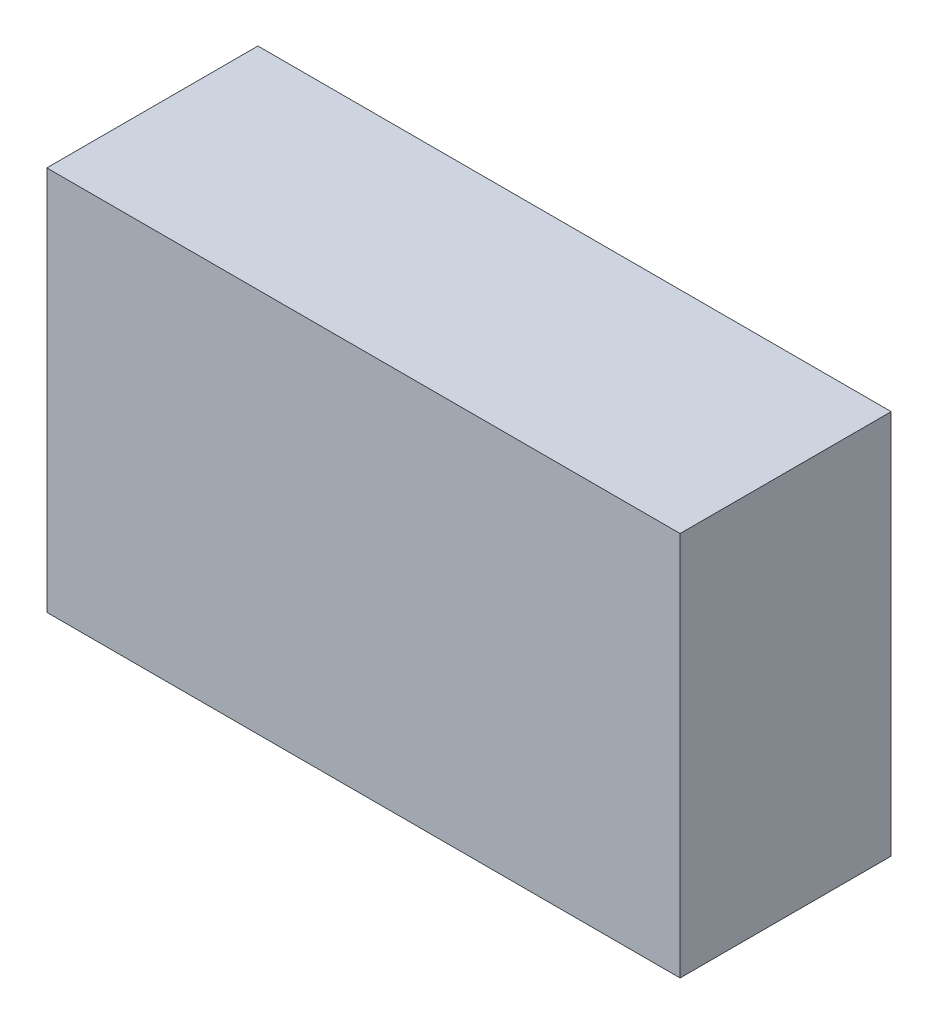
ISO-10303-21;
HEADER;
FILE_DESCRIPTION(('STEP AP214'),'2;1');
FILE_NAME('part.step','',(''),(''),'','','');
FILE_SCHEMA(('AUTOMOTIVE_DESIGN { 1 0 10303 214 1 1 1 1 }'));
ENDSEC;
DATA;
#1=APPLICATION_CONTEXT('core data for automotive mechanical design processes');
#2=APPLICATION_PROTOCOL_DEFINITION('international standard','automotive_design',2000,#1);
#3=PRODUCT_CONTEXT('',#1,'mechanical');
#4=PRODUCT('Part','Part','',(#3));
#5=PRODUCT_RELATED_PRODUCT_CATEGORY('part','',(#4));
#6=PRODUCT_DEFINITION_FORMATION('','',#4);
#7=PRODUCT_DEFINITION_CONTEXT('part definition',#1,'design');
#8=PRODUCT_DEFINITION('design','',#6,#7);
#9=PRODUCT_DEFINITION_SHAPE('','',#8);
#10=(LENGTH_UNIT() NAMED_UNIT(*) SI_UNIT(.MILLI.,.METRE.));
#11=(NAMED_UNIT(*) PLANE_ANGLE_UNIT() SI_UNIT($,.RADIAN.));
#12=(NAMED_UNIT(*) SI_UNIT($,.STERADIAN.) SOLID_ANGLE_UNIT());
#13=UNCERTAINTY_MEASURE_WITH_UNIT(LENGTH_MEASURE(1.E-05),#10,'distance_accuracy_value','');
#14=(GEOMETRIC_REPRESENTATION_CONTEXT(3) GLOBAL_UNCERTAINTY_ASSIGNED_CONTEXT((#13)) GLOBAL_UNIT_ASSIGNED_CONTEXT((#10,
#11,#12)) REPRESENTATION_CONTEXT('',''));
#15=CARTESIAN_POINT('',(0.,0.,0.));
#16=DIRECTION('',(0.,0.,1.));
#17=DIRECTION('',(1.,0.,0.));
#18=AXIS2_PLACEMENT_3D('',#15,#16,#17);
#19=CARTESIAN_POINT('',(25.5,-15.5,17.));
#20=DIRECTION('',(-1.,0.,0.));
#21=DIRECTION('',(0.,0.,1.));
#22=AXIS2_PLACEMENT_3D('',#19,#20,#21);
#23=PLANE('',#22);
#24=DIRECTION('',(0.,1.,0.));
#25=VECTOR('',#24,1.);
#26=CARTESIAN_POINT('',(25.5,-15.5,0.));
#27=LINE('',#26,#25);
#28=CARTESIAN_POINT('',(25.5,-15.5,0.));
#29=VERTEX_POINT('',#28);
#30=CARTESIAN_POINT('',(25.5,15.5,0.));
#31=VERTEX_POINT('',#30);
#32=EDGE_CURVE('E113',#29,#31,#27,.T.);
#33=ORIENTED_EDGE('',*,*,#32,.T.);
#34=DIRECTION('',(0.,0.,-1.));
#35=VECTOR('',#34,1.);
#36=CARTESIAN_POINT('',(25.5,15.5,17.));
#37=LINE('',#36,#35);
#38=CARTESIAN_POINT('',(25.5,15.5,17.));
#39=VERTEX_POINT('',#38);
#40=EDGE_CURVE('E11',#39,#31,#37,.T.);
#41=ORIENTED_EDGE('',*,*,#40,.F.);
#42=DIRECTION('',(0.,1.,0.));
#43=VECTOR('',#42,1.);
#44=CARTESIAN_POINT('',(25.5,-15.5,17.));
#45=LINE('',#44,#43);
#46=CARTESIAN_POINT('',(25.5,-15.5,17.));
#47=VERTEX_POINT('',#46);
#48=EDGE_CURVE('E97',#47,#39,#45,.T.);
#49=ORIENTED_EDGE('',*,*,#48,.F.);
#50=DIRECTION('',(0.,0.,-1.));
#51=VECTOR('',#50,1.);
#52=CARTESIAN_POINT('',(25.5,-15.5,17.));
#53=LINE('',#52,#51);
#54=EDGE_CURVE('E109',#47,#29,#53,.T.);
#55=ORIENTED_EDGE('',*,*,#54,.T.);
#56=EDGE_LOOP('',(#33,#41,#49,#55));
#57=FACE_BOUND('',#56,.T.);
#58=ADVANCED_FACE('F45',(#57),#23,.F.);
#59=CARTESIAN_POINT('',(-25.5,15.5,17.));
#60=DIRECTION('',(0.,-1.,0.));
#61=DIRECTION('',(0.,0.,-1.));
#62=AXIS2_PLACEMENT_3D('',#59,#60,#61);
#63=PLANE('',#62);
#64=DIRECTION('',(-1.,0.,0.));
#65=VECTOR('',#64,1.);
#66=CARTESIAN_POINT('',(-25.5,15.5,0.));
#67=LINE('',#66,#65);
#68=CARTESIAN_POINT('',(-25.5,15.5,0.));
#69=VERTEX_POINT('',#68);
#70=EDGE_CURVE('E102',#31,#69,#67,.T.);
#71=ORIENTED_EDGE('',*,*,#70,.T.);
#72=DIRECTION('',(0.,0.,-1.));
#73=VECTOR('',#72,1.);
#74=CARTESIAN_POINT('',(-25.5,15.5,17.));
#75=LINE('',#74,#73);
#76=CARTESIAN_POINT('',(-25.5,15.5,17.));
#77=VERTEX_POINT('',#76);
#78=EDGE_CURVE('E54',#77,#69,#75,.T.);
#79=ORIENTED_EDGE('',*,*,#78,.F.);
#80=DIRECTION('',(-1.,0.,0.));
#81=VECTOR('',#80,1.);
#82=CARTESIAN_POINT('',(-25.5,15.5,17.));
#83=LINE('',#82,#81);
#84=EDGE_CURVE('E92',#39,#77,#83,.T.);
#85=ORIENTED_EDGE('',*,*,#84,.F.);
#86=ORIENTED_EDGE('',*,*,#40,.T.);
#87=EDGE_LOOP('',(#71,#79,#85,#86));
#88=FACE_BOUND('',#87,.T.);
#89=ADVANCED_FACE('F101',(#88),#63,.F.);
#90=CARTESIAN_POINT('',(-25.5,-15.5,17.));
#91=DIRECTION('',(1.,0.,0.));
#92=DIRECTION('',(0.,0.,-1.));
#93=AXIS2_PLACEMENT_3D('',#90,#91,#92);
#94=PLANE('',#93);
#95=DIRECTION('',(0.,-1.,0.));
#96=VECTOR('',#95,1.);
#97=CARTESIAN_POINT('',(-25.5,-15.5,0.));
#98=LINE('',#97,#96);
#99=CARTESIAN_POINT('',(-25.5,-15.5,0.));
#100=VERTEX_POINT('',#99);
#101=EDGE_CURVE('E79',#69,#100,#98,.T.);
#102=ORIENTED_EDGE('',*,*,#101,.T.);
#103=DIRECTION('',(0.,0.,-1.));
#104=VECTOR('',#103,1.);
#105=CARTESIAN_POINT('',(-25.5,-15.5,17.));
#106=LINE('',#105,#104);
#107=CARTESIAN_POINT('',(-25.5,-15.5,17.));
#108=VERTEX_POINT('',#107);
#109=EDGE_CURVE('E104',#108,#100,#106,.T.);
#110=ORIENTED_EDGE('',*,*,#109,.F.);
#111=DIRECTION('',(0.,-1.,0.));
#112=VECTOR('',#111,1.);
#113=CARTESIAN_POINT('',(-25.5,-15.5,17.));
#114=LINE('',#113,#112);
#115=EDGE_CURVE('E95',#77,#108,#114,.T.);
#116=ORIENTED_EDGE('',*,*,#115,.F.);
#117=ORIENTED_EDGE('',*,*,#78,.T.);
#118=EDGE_LOOP('',(#102,#110,#116,#117));
#119=FACE_BOUND('',#118,.T.);
#120=ADVANCED_FACE('F105',(#119),#94,.F.);
#121=CARTESIAN_POINT('',(-25.5,-15.5,17.));
#122=DIRECTION('',(0.,1.,0.));
#123=DIRECTION('',(0.,0.,1.));
#124=AXIS2_PLACEMENT_3D('',#121,#122,#123);
#125=PLANE('',#124);
#126=DIRECTION('',(1.,0.,0.));
#127=VECTOR('',#126,1.);
#128=CARTESIAN_POINT('',(-25.5,-15.5,0.));
#129=LINE('',#128,#127);
#130=EDGE_CURVE('E85',#100,#29,#129,.T.);
#131=ORIENTED_EDGE('',*,*,#130,.T.);
#132=ORIENTED_EDGE('',*,*,#54,.F.);
#133=DIRECTION('',(1.,0.,0.));
#134=VECTOR('',#133,1.);
#135=CARTESIAN_POINT('',(-25.5,-15.5,17.));
#136=LINE('',#135,#134);
#137=EDGE_CURVE('E62',#108,#47,#136,.T.);
#138=ORIENTED_EDGE('',*,*,#137,.F.);
#139=ORIENTED_EDGE('',*,*,#109,.T.);
#140=EDGE_LOOP('',(#131,#132,#138,#139));
#141=FACE_BOUND('',#140,.T.);
#142=ADVANCED_FACE('F126',(#141),#125,.F.);
#143=CARTESIAN_POINT('',(0.,0.,17.));
#144=DIRECTION('',(0.,0.,-1.));
#145=DIRECTION('',(-1.,0.,0.));
#146=AXIS2_PLACEMENT_3D('',#143,#144,#145);
#147=PLANE('',#146);
#148=ORIENTED_EDGE('',*,*,#48,.T.);
#149=ORIENTED_EDGE('',*,*,#84,.T.);
#150=ORIENTED_EDGE('',*,*,#115,.T.);
#151=ORIENTED_EDGE('',*,*,#137,.T.);
#152=EDGE_LOOP('',(#148,#149,#150,#151));
#153=FACE_BOUND('',#152,.T.);
#154=ADVANCED_FACE('F93',(#153),#147,.F.);
#155=CARTESIAN_POINT('',(0.,0.,0.));
#156=DIRECTION('',(0.,0.,-1.));
#157=DIRECTION('',(-1.,0.,0.));
#158=AXIS2_PLACEMENT_3D('',#155,#156,#157);
#159=PLANE('',#158);
#160=ORIENTED_EDGE('',*,*,#32,.F.);
#161=ORIENTED_EDGE('',*,*,#130,.F.);
#162=ORIENTED_EDGE('',*,*,#101,.F.);
#163=ORIENTED_EDGE('',*,*,#70,.F.);
#164=EDGE_LOOP('',(#160,#161,#162,#163));
#165=FACE_BOUND('',#164,.T.);
#166=ADVANCED_FACE('F129',(#165),#159,.T.);
#167=CLOSED_SHELL('',(#58,#89,#120,#142,#154,#166));
#168=MANIFOLD_SOLID_BREP('B2',#167);
#169=ADVANCED_BREP_SHAPE_REPRESENTATION('',(#18,#168),#14);
#170=SHAPE_DEFINITION_REPRESENTATION(#9,#169);
ENDSEC;
END-ISO-10303-21;
